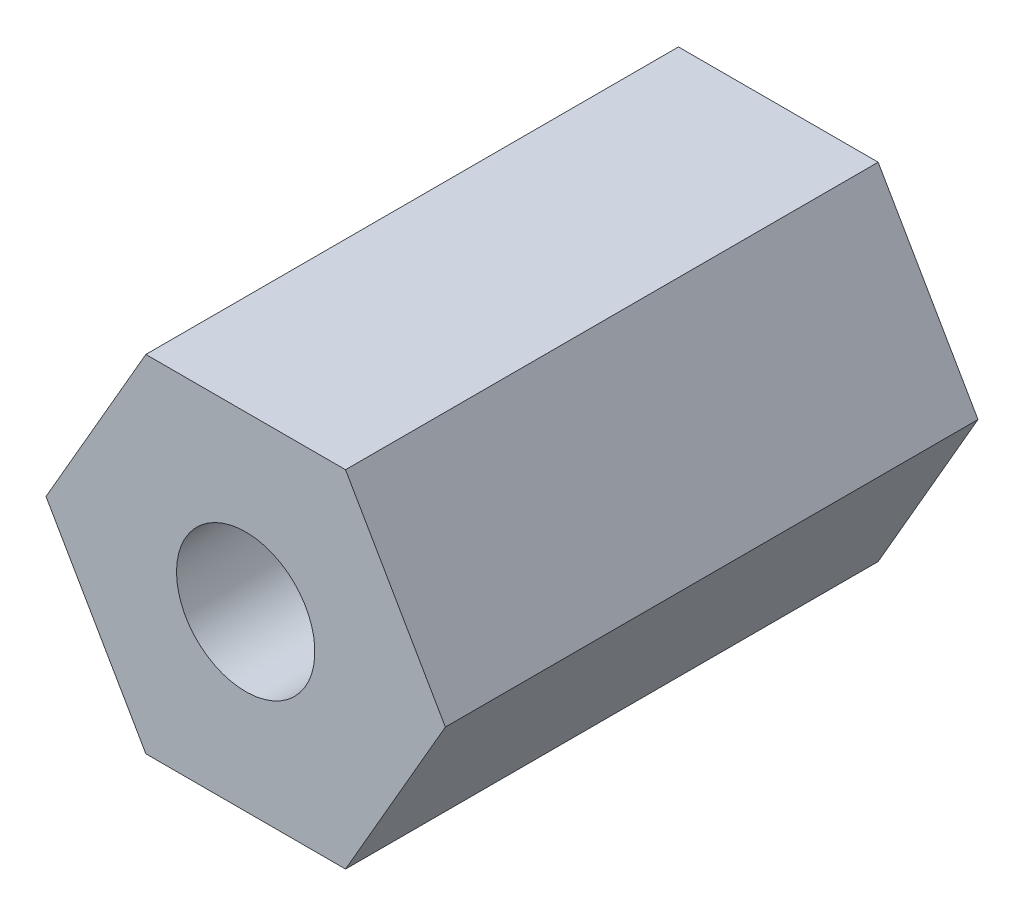
ISO-10303-21;
HEADER;
FILE_DESCRIPTION(('STEP AP214'),'2;1');
FILE_NAME('part.step','',(''),(''),'','','');
FILE_SCHEMA(('AUTOMOTIVE_DESIGN { 1 0 10303 214 1 1 1 1 }'));
ENDSEC;
DATA;
#1=APPLICATION_CONTEXT('core data for automotive mechanical design processes');
#2=APPLICATION_PROTOCOL_DEFINITION('international standard','automotive_design',2000,#1);
#3=PRODUCT_CONTEXT('',#1,'mechanical');
#4=PRODUCT('Part','Part','',(#3));
#5=PRODUCT_RELATED_PRODUCT_CATEGORY('part','',(#4));
#6=PRODUCT_DEFINITION_FORMATION('','',#4);
#7=PRODUCT_DEFINITION_CONTEXT('part definition',#1,'design');
#8=PRODUCT_DEFINITION('design','',#6,#7);
#9=PRODUCT_DEFINITION_SHAPE('','',#8);
#10=(LENGTH_UNIT() NAMED_UNIT(*) SI_UNIT(.MILLI.,.METRE.));
#11=(NAMED_UNIT(*) PLANE_ANGLE_UNIT() SI_UNIT($,.RADIAN.));
#12=(NAMED_UNIT(*) SI_UNIT($,.STERADIAN.) SOLID_ANGLE_UNIT());
#13=UNCERTAINTY_MEASURE_WITH_UNIT(LENGTH_MEASURE(1.E-05),#10,'distance_accuracy_value','');
#14=(GEOMETRIC_REPRESENTATION_CONTEXT(3) GLOBAL_UNCERTAINTY_ASSIGNED_CONTEXT((#13)) GLOBAL_UNIT_ASSIGNED_CONTEXT((#10,
#11,#12)) REPRESENTATION_CONTEXT('',''));
#15=CARTESIAN_POINT('',(0.,0.,0.));
#16=DIRECTION('',(0.,0.,1.));
#17=DIRECTION('',(1.,0.,0.));
#18=AXIS2_PLACEMENT_3D('',#15,#16,#17);
#19=CARTESIAN_POINT('',(0.,0.,15.4));
#20=DIRECTION('',(0.,0.,1.));
#21=DIRECTION('',(1.,0.,0.));
#22=AXIS2_PLACEMENT_3D('',#19,#20,#21);
#23=PLANE('',#22);
#24=DIRECTION('',(1.,0.,0.));
#25=VECTOR('',#24,1.);
#26=CARTESIAN_POINT('',(-2.88675134594814,-5.00000000000002,15.4));
#27=LINE('',#26,#25);
#28=CARTESIAN_POINT('',(-2.88675134594814,-5.00000000000002,15.4));
#29=VERTEX_POINT('',#28);
#30=CARTESIAN_POINT('',(2.88675134594814,-5.00000000000002,15.4));
#31=VERTEX_POINT('',#30);
#32=EDGE_CURVE('E131',#29,#31,#27,.T.);
#33=ORIENTED_EDGE('',*,*,#32,.T.);
#34=DIRECTION('',(0.5,0.866025403784439,0.));
#35=VECTOR('',#34,1.);
#36=CARTESIAN_POINT('',(2.88675134594814,-5.00000000000002,15.4));
#37=LINE('',#36,#35);
#38=CARTESIAN_POINT('',(5.77350269189628,0.,15.4));
#39=VERTEX_POINT('',#38);
#40=EDGE_CURVE('E89',#31,#39,#37,.T.);
#41=ORIENTED_EDGE('',*,*,#40,.T.);
#42=DIRECTION('',(-0.5,0.866025403784438,0.));
#43=VECTOR('',#42,1.);
#44=CARTESIAN_POINT('',(5.77350269189628,0.,15.4));
#45=LINE('',#44,#43);
#46=CARTESIAN_POINT('',(2.88675134594814,5.00000000000002,15.4));
#47=VERTEX_POINT('',#46);
#48=EDGE_CURVE('E102',#39,#47,#45,.T.);
#49=ORIENTED_EDGE('',*,*,#48,.T.);
#50=DIRECTION('',(-1.,0.,0.));
#51=VECTOR('',#50,1.);
#52=CARTESIAN_POINT('',(2.88675134594814,5.00000000000002,15.4));
#53=LINE('',#52,#51);
#54=CARTESIAN_POINT('',(-2.88675134594814,5.00000000000002,15.4));
#55=VERTEX_POINT('',#54);
#56=EDGE_CURVE('E96',#47,#55,#53,.T.);
#57=ORIENTED_EDGE('',*,*,#56,.T.);
#58=DIRECTION('',(-0.5,-0.866025403784439,0.));
#59=VECTOR('',#58,1.);
#60=CARTESIAN_POINT('',(-2.88675134594814,5.00000000000002,15.4));
#61=LINE('',#60,#59);
#62=CARTESIAN_POINT('',(-5.77350269189628,0.,15.4));
#63=VERTEX_POINT('',#62);
#64=EDGE_CURVE('E100',#55,#63,#61,.T.);
#65=ORIENTED_EDGE('',*,*,#64,.T.);
#66=DIRECTION('',(0.5,-0.866025403784439,0.));
#67=VECTOR('',#66,1.);
#68=CARTESIAN_POINT('',(-5.77350269189628,0.,15.4));
#69=LINE('',#68,#67);
#70=EDGE_CURVE('E52',#63,#29,#69,.T.);
#71=ORIENTED_EDGE('',*,*,#70,.T.);
#72=EDGE_LOOP('',(#33,#41,#49,#57,#65,#71));
#73=FACE_BOUND('',#72,.T.);
#74=CARTESIAN_POINT('',(0.,0.,15.4));
#75=DIRECTION('',(0.,0.,1.));
#76=DIRECTION('',(1.,0.,0.));
#77=AXIS2_PLACEMENT_3D('',#74,#75,#76);
#78=CIRCLE('',#77,2.);
#79=CARTESIAN_POINT('',(-2.,0.,15.4));
#80=VERTEX_POINT('',#79);
#81=EDGE_CURVE('E124',#80,#80,#78,.T.);
#82=ORIENTED_EDGE('',*,*,#81,.F.);
#83=EDGE_LOOP('',(#82));
#84=FACE_BOUND('',#83,.T.);
#85=ADVANCED_FACE('F35',(#73,#84),#23,.T.);
#86=CARTESIAN_POINT('',(0.,0.,0.));
#87=DIRECTION('',(0.,0.,1.));
#88=DIRECTION('',(1.,0.,0.));
#89=AXIS2_PLACEMENT_3D('',#86,#87,#88);
#90=PLANE('',#89);
#91=DIRECTION('',(1.,0.,0.));
#92=VECTOR('',#91,1.);
#93=CARTESIAN_POINT('',(-2.88675134594814,-5.00000000000002,0.));
#94=LINE('',#93,#92);
#95=CARTESIAN_POINT('',(-2.88675134594814,-5.00000000000002,0.));
#96=VERTEX_POINT('',#95);
#97=CARTESIAN_POINT('',(2.88675134594814,-5.00000000000002,0.));
#98=VERTEX_POINT('',#97);
#99=EDGE_CURVE('E120',#96,#98,#94,.T.);
#100=ORIENTED_EDGE('',*,*,#99,.F.);
#101=DIRECTION('',(0.5,-0.866025403784439,0.));
#102=VECTOR('',#101,1.);
#103=CARTESIAN_POINT('',(-5.77350269189628,0.,0.));
#104=LINE('',#103,#102);
#105=CARTESIAN_POINT('',(-5.77350269189628,0.,0.));
#106=VERTEX_POINT('',#105);
#107=EDGE_CURVE('E81',#106,#96,#104,.T.);
#108=ORIENTED_EDGE('',*,*,#107,.F.);
#109=DIRECTION('',(-0.5,-0.866025403784439,0.));
#110=VECTOR('',#109,1.);
#111=CARTESIAN_POINT('',(-2.88675134594814,5.00000000000002,0.));
#112=LINE('',#111,#110);
#113=CARTESIAN_POINT('',(-2.88675134594814,5.00000000000002,0.));
#114=VERTEX_POINT('',#113);
#115=EDGE_CURVE('E75',#114,#106,#112,.T.);
#116=ORIENTED_EDGE('',*,*,#115,.F.);
#117=DIRECTION('',(-1.,0.,0.));
#118=VECTOR('',#117,1.);
#119=CARTESIAN_POINT('',(2.88675134594814,5.00000000000002,0.));
#120=LINE('',#119,#118);
#121=CARTESIAN_POINT('',(2.88675134594814,5.00000000000002,0.));
#122=VERTEX_POINT('',#121);
#123=EDGE_CURVE('E110',#122,#114,#120,.T.);
#124=ORIENTED_EDGE('',*,*,#123,.F.);
#125=DIRECTION('',(-0.5,0.866025403784438,0.));
#126=VECTOR('',#125,1.);
#127=CARTESIAN_POINT('',(5.77350269189628,0.,0.));
#128=LINE('',#127,#126);
#129=CARTESIAN_POINT('',(5.77350269189628,0.,0.));
#130=VERTEX_POINT('',#129);
#131=EDGE_CURVE('E126',#130,#122,#128,.T.);
#132=ORIENTED_EDGE('',*,*,#131,.F.);
#133=DIRECTION('',(0.5,0.866025403784439,0.));
#134=VECTOR('',#133,1.);
#135=CARTESIAN_POINT('',(2.88675134594814,-5.00000000000002,0.));
#136=LINE('',#135,#134);
#137=EDGE_CURVE('E123',#98,#130,#136,.T.);
#138=ORIENTED_EDGE('',*,*,#137,.F.);
#139=EDGE_LOOP('',(#100,#108,#116,#124,#132,#138));
#140=FACE_BOUND('',#139,.T.);
#141=CARTESIAN_POINT('',(0.,0.,0.));
#142=DIRECTION('',(0.,0.,1.));
#143=DIRECTION('',(1.,0.,0.));
#144=AXIS2_PLACEMENT_3D('',#141,#142,#143);
#145=CIRCLE('',#144,2.);
#146=CARTESIAN_POINT('',(-2.,0.,0.));
#147=VERTEX_POINT('',#146);
#148=EDGE_CURVE('E224',#147,#147,#145,.T.);
#149=ORIENTED_EDGE('',*,*,#148,.T.);
#150=EDGE_LOOP('',(#149));
#151=FACE_BOUND('',#150,.T.);
#152=ADVANCED_FACE('F140',(#140,#151),#90,.F.);
#153=CARTESIAN_POINT('',(-2.88675134594814,-5.00000000000002,15.4));
#154=DIRECTION('',(0.,1.,0.));
#155=DIRECTION('',(-1.,0.,0.));
#156=AXIS2_PLACEMENT_3D('',#153,#154,#155);
#157=PLANE('',#156);
#158=ORIENTED_EDGE('',*,*,#99,.T.);
#159=DIRECTION('',(0.,0.,-1.));
#160=VECTOR('',#159,1.);
#161=CARTESIAN_POINT('',(2.88675134594814,-5.00000000000002,15.4));
#162=LINE('',#161,#160);
#163=EDGE_CURVE('E11',#31,#98,#162,.T.);
#164=ORIENTED_EDGE('',*,*,#163,.F.);
#165=ORIENTED_EDGE('',*,*,#32,.F.);
#166=DIRECTION('',(0.,0.,-1.));
#167=VECTOR('',#166,1.);
#168=CARTESIAN_POINT('',(-2.88675134594814,-5.00000000000002,15.4));
#169=LINE('',#168,#167);
#170=EDGE_CURVE('E116',#29,#96,#169,.T.);
#171=ORIENTED_EDGE('',*,*,#170,.T.);
#172=EDGE_LOOP('',(#158,#164,#165,#171));
#173=FACE_BOUND('',#172,.T.);
#174=ADVANCED_FACE('F37',(#173),#157,.F.);
#175=CARTESIAN_POINT('',(2.88675134594814,-5.00000000000002,15.4));
#176=DIRECTION('',(-0.866025403784439,0.5,0.));
#177=DIRECTION('',(-0.5,-0.866025403784439,0.));
#178=AXIS2_PLACEMENT_3D('',#175,#176,#177);
#179=PLANE('',#178);
#180=ORIENTED_EDGE('',*,*,#137,.T.);
#181=DIRECTION('',(0.,0.,-1.));
#182=VECTOR('',#181,1.);
#183=CARTESIAN_POINT('',(5.77350269189628,0.,15.4));
#184=LINE('',#183,#182);
#185=EDGE_CURVE('E44',#39,#130,#184,.T.);
#186=ORIENTED_EDGE('',*,*,#185,.F.);
#187=ORIENTED_EDGE('',*,*,#40,.F.);
#188=ORIENTED_EDGE('',*,*,#163,.T.);
#189=EDGE_LOOP('',(#180,#186,#187,#188));
#190=FACE_BOUND('',#189,.T.);
#191=ADVANCED_FACE('F165',(#190),#179,.F.);
#192=CARTESIAN_POINT('',(5.77350269189628,0.,15.4));
#193=DIRECTION('',(-0.866025403784439,-0.5,0.));
#194=DIRECTION('',(0.5,-0.866025403784439,0.));
#195=AXIS2_PLACEMENT_3D('',#192,#193,#194);
#196=PLANE('',#195);
#197=ORIENTED_EDGE('',*,*,#131,.T.);
#198=DIRECTION('',(0.,0.,-1.));
#199=VECTOR('',#198,1.);
#200=CARTESIAN_POINT('',(2.88675134594814,5.00000000000002,15.4));
#201=LINE('',#200,#199);
#202=EDGE_CURVE('E111',#47,#122,#201,.T.);
#203=ORIENTED_EDGE('',*,*,#202,.F.);
#204=ORIENTED_EDGE('',*,*,#48,.F.);
#205=ORIENTED_EDGE('',*,*,#185,.T.);
#206=EDGE_LOOP('',(#197,#203,#204,#205));
#207=FACE_BOUND('',#206,.T.);
#208=ADVANCED_FACE('F137',(#207),#196,.F.);
#209=CARTESIAN_POINT('',(2.88675134594814,5.00000000000002,15.4));
#210=DIRECTION('',(0.,-1.,0.));
#211=DIRECTION('',(0.,0.,-1.));
#212=AXIS2_PLACEMENT_3D('',#209,#210,#211);
#213=PLANE('',#212);
#214=ORIENTED_EDGE('',*,*,#123,.T.);
#215=DIRECTION('',(0.,0.,-1.));
#216=VECTOR('',#215,1.);
#217=CARTESIAN_POINT('',(-2.88675134594814,5.00000000000002,15.4));
#218=LINE('',#217,#216);
#219=EDGE_CURVE('E107',#55,#114,#218,.T.);
#220=ORIENTED_EDGE('',*,*,#219,.F.);
#221=ORIENTED_EDGE('',*,*,#56,.F.);
#222=ORIENTED_EDGE('',*,*,#202,.T.);
#223=EDGE_LOOP('',(#214,#220,#221,#222));
#224=FACE_BOUND('',#223,.T.);
#225=ADVANCED_FACE('F108',(#224),#213,.F.);
#226=CARTESIAN_POINT('',(-2.88675134594814,5.00000000000002,15.4));
#227=DIRECTION('',(0.866025403784439,-0.5,0.));
#228=DIRECTION('',(0.5,0.866025403784439,0.));
#229=AXIS2_PLACEMENT_3D('',#226,#227,#228);
#230=PLANE('',#229);
#231=ORIENTED_EDGE('',*,*,#115,.T.);
#232=DIRECTION('',(0.,0.,-1.));
#233=VECTOR('',#232,1.);
#234=CARTESIAN_POINT('',(-5.77350269189628,0.,15.4));
#235=LINE('',#234,#233);
#236=EDGE_CURVE('E112',#63,#106,#235,.T.);
#237=ORIENTED_EDGE('',*,*,#236,.F.);
#238=ORIENTED_EDGE('',*,*,#64,.F.);
#239=ORIENTED_EDGE('',*,*,#219,.T.);
#240=EDGE_LOOP('',(#231,#237,#238,#239));
#241=FACE_BOUND('',#240,.T.);
#242=ADVANCED_FACE('F114',(#241),#230,.F.);
#243=CARTESIAN_POINT('',(-5.77350269189628,0.,15.4));
#244=DIRECTION('',(0.866025403784439,0.5,0.));
#245=DIRECTION('',(-0.5,0.866025403784439,0.));
#246=AXIS2_PLACEMENT_3D('',#243,#244,#245);
#247=PLANE('',#246);
#248=ORIENTED_EDGE('',*,*,#107,.T.);
#249=ORIENTED_EDGE('',*,*,#170,.F.);
#250=ORIENTED_EDGE('',*,*,#70,.F.);
#251=ORIENTED_EDGE('',*,*,#236,.T.);
#252=EDGE_LOOP('',(#248,#249,#250,#251));
#253=FACE_BOUND('',#252,.T.);
#254=ADVANCED_FACE('F145',(#253),#247,.F.);
#255=CARTESIAN_POINT('',(0.,0.,15.4));
#256=DIRECTION('',(0.,0.,-1.));
#257=DIRECTION('',(-1.,0.,0.));
#258=AXIS2_PLACEMENT_3D('',#255,#256,#257);
#259=CYLINDRICAL_SURFACE('',#258,2.);
#260=CARTESIAN_POINT('',(-2.,0.,15.4));
#261=CARTESIAN_POINT('',(-2.,0.,15.2395833333333));
#262=CARTESIAN_POINT('',(-2.,0.,15.0791666666667));
#263=CARTESIAN_POINT('',(-2.,0.,14.7583333333333));
#264=CARTESIAN_POINT('',(-2.,0.,14.5979166666667));
#265=CARTESIAN_POINT('',(-2.,0.,14.2770833333333));
#266=CARTESIAN_POINT('',(-2.,0.,14.1166666666667));
#267=CARTESIAN_POINT('',(-2.,0.,13.7958333333333));
#268=CARTESIAN_POINT('',(-2.,0.,13.6354166666667));
#269=CARTESIAN_POINT('',(-2.,0.,13.3145833333333));
#270=CARTESIAN_POINT('',(-2.,0.,13.1541666666667));
#271=CARTESIAN_POINT('',(-2.,0.,12.8333333333333));
#272=CARTESIAN_POINT('',(-2.,0.,12.6729166666667));
#273=CARTESIAN_POINT('',(-2.,0.,12.3520833333333));
#274=CARTESIAN_POINT('',(-2.,0.,12.1916666666667));
#275=CARTESIAN_POINT('',(-2.,0.,11.8708333333333));
#276=CARTESIAN_POINT('',(-2.,0.,11.7104166666667));
#277=CARTESIAN_POINT('',(-2.,0.,11.3895833333333));
#278=CARTESIAN_POINT('',(-2.,0.,11.2291666666667));
#279=CARTESIAN_POINT('',(-2.,0.,10.9083333333333));
#280=CARTESIAN_POINT('',(-2.,0.,10.7479166666667));
#281=CARTESIAN_POINT('',(-2.,0.,10.4270833333333));
#282=CARTESIAN_POINT('',(-2.,0.,10.2666666666667));
#283=CARTESIAN_POINT('',(-2.,0.,9.94583333333333));
#284=CARTESIAN_POINT('',(-2.,0.,9.78541666666667));
#285=CARTESIAN_POINT('',(-2.,0.,9.46458333333333));
#286=CARTESIAN_POINT('',(-2.,0.,9.30416666666667));
#287=CARTESIAN_POINT('',(-2.,0.,8.98333333333333));
#288=CARTESIAN_POINT('',(-2.,0.,8.82291666666667));
#289=CARTESIAN_POINT('',(-2.,0.,8.50208333333333));
#290=CARTESIAN_POINT('',(-2.,0.,8.34166666666667));
#291=CARTESIAN_POINT('',(-2.,0.,8.02083333333333));
#292=CARTESIAN_POINT('',(-2.,0.,7.86041666666667));
#293=CARTESIAN_POINT('',(-2.,0.,7.53958333333333));
#294=CARTESIAN_POINT('',(-2.,0.,7.37916666666667));
#295=CARTESIAN_POINT('',(-2.,0.,7.05833333333333));
#296=CARTESIAN_POINT('',(-2.,0.,6.89791666666667));
#297=CARTESIAN_POINT('',(-2.,0.,6.57708333333333));
#298=CARTESIAN_POINT('',(-2.,0.,6.41666666666667));
#299=CARTESIAN_POINT('',(-2.,0.,6.09583333333333));
#300=CARTESIAN_POINT('',(-2.,0.,5.93541666666667));
#301=CARTESIAN_POINT('',(-2.,0.,5.61458333333333));
#302=CARTESIAN_POINT('',(-2.,0.,5.45416666666667));
#303=CARTESIAN_POINT('',(-2.,0.,5.13333333333333));
#304=CARTESIAN_POINT('',(-2.,0.,4.97291666666667));
#305=CARTESIAN_POINT('',(-2.,0.,4.65208333333333));
#306=CARTESIAN_POINT('',(-2.,0.,4.49166666666667));
#307=CARTESIAN_POINT('',(-2.,0.,4.17083333333333));
#308=CARTESIAN_POINT('',(-2.,0.,4.01041666666667));
#309=CARTESIAN_POINT('',(-2.,0.,3.68958333333333));
#310=CARTESIAN_POINT('',(-2.,0.,3.52916666666667));
#311=CARTESIAN_POINT('',(-2.,0.,3.20833333333333));
#312=CARTESIAN_POINT('',(-2.,0.,3.04791666666667));
#313=CARTESIAN_POINT('',(-2.,0.,2.72708333333333));
#314=CARTESIAN_POINT('',(-2.,0.,2.56666666666667));
#315=CARTESIAN_POINT('',(-2.,0.,2.24583333333333));
#316=CARTESIAN_POINT('',(-2.,0.,2.08541666666666));
#317=CARTESIAN_POINT('',(-2.,0.,1.76458333333333));
#318=CARTESIAN_POINT('',(-2.,0.,1.60416666666667));
#319=CARTESIAN_POINT('',(-2.,0.,1.28333333333333));
#320=CARTESIAN_POINT('',(-2.,0.,1.12291666666666));
#321=CARTESIAN_POINT('',(-2.,0.,0.802083333333332));
#322=CARTESIAN_POINT('',(-2.,0.,0.641666666666665));
#323=CARTESIAN_POINT('',(-2.,0.,0.320833333333332));
#324=CARTESIAN_POINT('',(-2.,0.,0.160416666666665));
#325=CARTESIAN_POINT('',(-2.,0.,0.));
#326=B_SPLINE_CURVE_WITH_KNOTS('',3,(#260,#261,#262,#263,#264,#265,#266,#267,#268,#269,#270,
#271,#272,#273,#274,#275,#276,#277,#278,#279,#280,#281,#282,#283,#284,#285,#286,#287,#288,#289,
#290,#291,#292,#293,#294,#295,#296,#297,#298,#299,#300,#301,#302,#303,#304,#305,#306,#307,#308,
#309,#310,#311,#312,#313,#314,#315,#316,#317,#318,#319,#320,#321,#322,#323,#324,#325),
.UNSPECIFIED.,.F.,.F.,(4,2,2,2,2,2,2,2,2,2,2,2,2,2,2,2,2,2,2,2,2,2,2,2,2,2,2,2,2,2,2,2,4),(0.,
0.481249999999999,0.9625,1.44375,1.925,2.40625,2.8875,3.36875,3.85,4.33125,4.8125,5.29375,5.775,
6.25625,6.7375,7.21875,7.7,8.18125,8.6625,9.14375,9.625,10.10625,10.5875,11.06875,11.55,
12.03125,12.5125,12.99375,13.475,13.95625,14.4375,14.91875,15.4),.UNSPECIFIED.);
#327=EDGE_CURVE('BSEAM147',#80,#147,#326,.T.);
#328=ORIENTED_EDGE('',*,*,#81,.T.);
#329=ORIENTED_EDGE('',*,*,#148,.F.);
#330=ORIENTED_EDGE('',*,*,#327,.T.);
#331=ORIENTED_EDGE('',*,*,#327,.F.);
#332=EDGE_LOOP('',(#328,#330,#329,#331));
#333=FACE_BOUND('',#332,.T.);
#334=ADVANCED_FACE('F147',(#333),#259,.F.);
#335=CLOSED_SHELL('',(#85,#152,#174,#191,#208,#225,#242,#254,#334));
#336=MANIFOLD_SOLID_BREP('B2',#335);
#337=ADVANCED_BREP_SHAPE_REPRESENTATION('',(#18,#336),#14);
#338=SHAPE_DEFINITION_REPRESENTATION(#9,#337);
ENDSEC;
END-ISO-10303-21;
